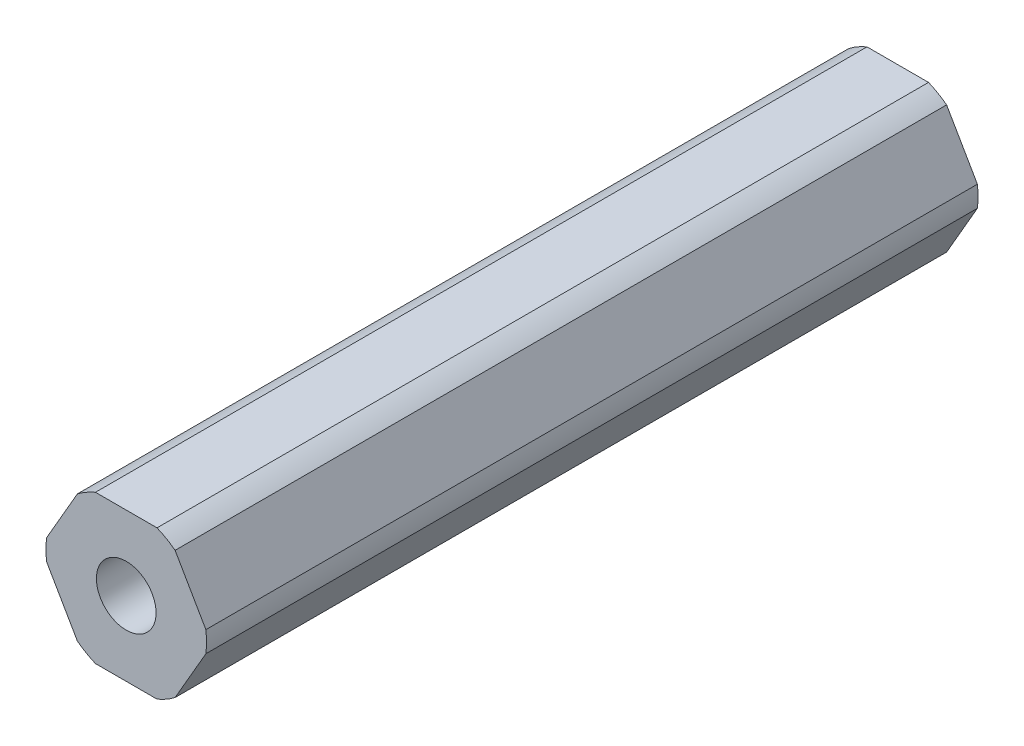
ISO-10303-21;
HEADER;
FILE_DESCRIPTION(('STEP AP214'),'2;1');
FILE_NAME('part.step','',(''),(''),'','','');
FILE_SCHEMA(('AUTOMOTIVE_DESIGN { 1 0 10303 214 1 1 1 1 }'));
ENDSEC;
DATA;
#1=APPLICATION_CONTEXT('core data for automotive mechanical design processes');
#2=APPLICATION_PROTOCOL_DEFINITION('international standard','automotive_design',2000,#1);
#3=PRODUCT_CONTEXT('',#1,'mechanical');
#4=PRODUCT('Part','Part','',(#3));
#5=PRODUCT_RELATED_PRODUCT_CATEGORY('part','',(#4));
#6=PRODUCT_DEFINITION_FORMATION('','',#4);
#7=PRODUCT_DEFINITION_CONTEXT('part definition',#1,'design');
#8=PRODUCT_DEFINITION('design','',#6,#7);
#9=PRODUCT_DEFINITION_SHAPE('','',#8);
#10=(LENGTH_UNIT() NAMED_UNIT(*) SI_UNIT(.MILLI.,.METRE.));
#11=(NAMED_UNIT(*) PLANE_ANGLE_UNIT() SI_UNIT($,.RADIAN.));
#12=(NAMED_UNIT(*) SI_UNIT($,.STERADIAN.) SOLID_ANGLE_UNIT());
#13=UNCERTAINTY_MEASURE_WITH_UNIT(LENGTH_MEASURE(1.E-05),#10,'distance_accuracy_value','');
#14=(GEOMETRIC_REPRESENTATION_CONTEXT(3) GLOBAL_UNCERTAINTY_ASSIGNED_CONTEXT((#13)) GLOBAL_UNIT_ASSIGNED_CONTEXT((#10,
#11,#12)) REPRESENTATION_CONTEXT('',''));
#15=CARTESIAN_POINT('',(0.,0.,0.));
#16=DIRECTION('',(0.,0.,1.));
#17=DIRECTION('',(1.,0.,0.));
#18=AXIS2_PLACEMENT_3D('',#15,#16,#17);
#19=CARTESIAN_POINT('',(0.,0.,66.04));
#20=DIRECTION('',(0.,0.,1.));
#21=DIRECTION('',(1.,0.,0.));
#22=AXIS2_PLACEMENT_3D('',#19,#20,#21);
#23=PLANE('',#22);
#24=CARTESIAN_POINT('',(0.,0.,66.04));
#25=DIRECTION('',(0.,0.,1.));
#26=DIRECTION('',(1.,0.,0.));
#27=AXIS2_PLACEMENT_3D('',#24,#25,#26);
#28=CIRCLE('',#27,6.875);
#29=CARTESIAN_POINT('',(-6.81675182633099,0.89303949420678,66.04));
#30=VERTEX_POINT('',#29);
#31=CARTESIAN_POINT('',(-6.81675182633099,-0.893039494206792,66.04));
#32=VERTEX_POINT('',#31);
#33=EDGE_CURVE('E179',#30,#32,#28,.T.);
#34=ORIENTED_EDGE('',*,*,#33,.T.);
#35=DIRECTION('',(0.5,-0.866025403784438,0.));
#36=VECTOR('',#35,1.);
#37=CARTESIAN_POINT('',(-6.81675182633099,-0.893039494206792,66.04));
#38=LINE('',#37,#36);
#39=CARTESIAN_POINT('',(-4.18177080173138,-5.45696050579321,66.04));
#40=VERTEX_POINT('',#39);
#41=EDGE_CURVE('E107',#32,#40,#38,.T.);
#42=ORIENTED_EDGE('',*,*,#41,.T.);
#43=CARTESIAN_POINT('',(0.,0.,66.04));
#44=DIRECTION('',(0.,0.,1.));
#45=DIRECTION('',(1.,0.,0.));
#46=AXIS2_PLACEMENT_3D('',#43,#44,#45);
#47=CIRCLE('',#46,6.875);
#48=CARTESIAN_POINT('',(-2.6349810245996,-6.35,66.04));
#49=VERTEX_POINT('',#48);
#50=EDGE_CURVE('E206',#40,#49,#47,.T.);
#51=ORIENTED_EDGE('',*,*,#50,.T.);
#52=DIRECTION('',(1.,0.,0.));
#53=VECTOR('',#52,1.);
#54=CARTESIAN_POINT('',(-2.63498102459961,-6.35,66.04));
#55=LINE('',#54,#53);
#56=CARTESIAN_POINT('',(2.63498102459961,-6.35,66.04));
#57=VERTEX_POINT('',#56);
#58=EDGE_CURVE('E225',#49,#57,#55,.T.);
#59=ORIENTED_EDGE('',*,*,#58,.T.);
#60=CARTESIAN_POINT('',(0.,0.,66.04));
#61=DIRECTION('',(0.,0.,1.));
#62=DIRECTION('',(1.,0.,0.));
#63=AXIS2_PLACEMENT_3D('',#60,#61,#62);
#64=CIRCLE('',#63,6.875);
#65=CARTESIAN_POINT('',(4.18177080173138,-5.45696050579321,66.04));
#66=VERTEX_POINT('',#65);
#67=EDGE_CURVE('E222',#57,#66,#64,.T.);
#68=ORIENTED_EDGE('',*,*,#67,.T.);
#69=DIRECTION('',(0.5,0.866025403784439,0.));
#70=VECTOR('',#69,1.);
#71=CARTESIAN_POINT('',(4.18177080173138,-5.45696050579321,66.04));
#72=LINE('',#71,#70);
#73=CARTESIAN_POINT('',(6.81675182633099,-0.893039494206781,66.04));
#74=VERTEX_POINT('',#73);
#75=EDGE_CURVE('E224',#66,#74,#72,.T.);
#76=ORIENTED_EDGE('',*,*,#75,.T.);
#77=CARTESIAN_POINT('',(0.,0.,66.04));
#78=DIRECTION('',(0.,0.,1.));
#79=DIRECTION('',(1.,0.,0.));
#80=AXIS2_PLACEMENT_3D('',#77,#78,#79);
#81=CIRCLE('',#80,6.875);
#82=CARTESIAN_POINT('',(6.81675182633099,0.893039494206792,66.04));
#83=VERTEX_POINT('',#82);
#84=EDGE_CURVE('E227',#74,#83,#81,.T.);
#85=ORIENTED_EDGE('',*,*,#84,.T.);
#86=DIRECTION('',(-0.500000000000001,0.866025403784438,0.));
#87=VECTOR('',#86,1.);
#88=CARTESIAN_POINT('',(6.81675182633099,0.893039494206793,66.04));
#89=LINE('',#88,#87);
#90=CARTESIAN_POINT('',(4.18177080173138,5.45696050579321,66.04));
#91=VERTEX_POINT('',#90);
#92=EDGE_CURVE('E233',#83,#91,#89,.T.);
#93=ORIENTED_EDGE('',*,*,#92,.T.);
#94=CARTESIAN_POINT('',(0.,0.,66.04));
#95=DIRECTION('',(0.,0.,1.));
#96=DIRECTION('',(1.,0.,0.));
#97=AXIS2_PLACEMENT_3D('',#94,#95,#96);
#98=CIRCLE('',#97,6.875);
#99=CARTESIAN_POINT('',(2.63498102459961,6.35,66.04));
#100=VERTEX_POINT('',#99);
#101=EDGE_CURVE('E138',#91,#100,#98,.T.);
#102=ORIENTED_EDGE('',*,*,#101,.T.);
#103=DIRECTION('',(-1.,0.,0.));
#104=VECTOR('',#103,1.);
#105=CARTESIAN_POINT('',(2.63498102459961,6.35,66.04));
#106=LINE('',#105,#104);
#107=CARTESIAN_POINT('',(-2.63498102459961,6.35,66.04));
#108=VERTEX_POINT('',#107);
#109=EDGE_CURVE('E132',#100,#108,#106,.T.);
#110=ORIENTED_EDGE('',*,*,#109,.T.);
#111=CARTESIAN_POINT('',(0.,0.,66.04));
#112=DIRECTION('',(0.,0.,1.));
#113=DIRECTION('',(1.,0.,0.));
#114=AXIS2_PLACEMENT_3D('',#111,#112,#113);
#115=CIRCLE('',#114,6.875);
#116=CARTESIAN_POINT('',(-4.18177080173138,5.45696050579321,66.04));
#117=VERTEX_POINT('',#116);
#118=EDGE_CURVE('E136',#108,#117,#115,.T.);
#119=ORIENTED_EDGE('',*,*,#118,.T.);
#120=DIRECTION('',(-0.499999999999999,-0.866025403784439,0.));
#121=VECTOR('',#120,1.);
#122=CARTESIAN_POINT('',(-4.18177080173138,5.45696050579321,66.04));
#123=LINE('',#122,#121);
#124=EDGE_CURVE('E52',#117,#30,#123,.T.);
#125=ORIENTED_EDGE('',*,*,#124,.T.);
#126=EDGE_LOOP('',(#34,#42,#51,#59,#68,#76,#85,#93,#102,#110,#119,#125));
#127=FACE_BOUND('',#126,.T.);
#128=CARTESIAN_POINT('',(0.,0.,66.04));
#129=DIRECTION('',(0.,0.,1.));
#130=DIRECTION('',(1.,0.,0.));
#131=AXIS2_PLACEMENT_3D('',#128,#129,#130);
#132=CIRCLE('',#131,2.5527);
#133=CARTESIAN_POINT('',(2.5527,0.,66.04));
#134=VERTEX_POINT('',#133);
#135=EDGE_CURVE('E160',#134,#134,#132,.T.);
#136=ORIENTED_EDGE('',*,*,#135,.F.);
#137=EDGE_LOOP('',(#136));
#138=FACE_BOUND('',#137,.T.);
#139=ADVANCED_FACE('F35',(#127,#138),#23,.T.);
#140=CARTESIAN_POINT('',(0.,0.,0.));
#141=DIRECTION('',(0.,0.,1.));
#142=DIRECTION('',(1.,0.,0.));
#143=AXIS2_PLACEMENT_3D('',#140,#141,#142);
#144=PLANE('',#143);
#145=CARTESIAN_POINT('',(0.,0.,0.));
#146=DIRECTION('',(0.,0.,1.));
#147=DIRECTION('',(1.,0.,0.));
#148=AXIS2_PLACEMENT_3D('',#145,#146,#147);
#149=CIRCLE('',#148,6.875);
#150=CARTESIAN_POINT('',(-6.81675182633099,0.89303949420678,0.));
#151=VERTEX_POINT('',#150);
#152=CARTESIAN_POINT('',(-6.81675182633099,-0.893039494206792,0.));
#153=VERTEX_POINT('',#152);
#154=EDGE_CURVE('E156',#151,#153,#149,.T.);
#155=ORIENTED_EDGE('',*,*,#154,.F.);
#156=DIRECTION('',(-0.499999999999999,-0.866025403784439,0.));
#157=VECTOR('',#156,1.);
#158=CARTESIAN_POINT('',(-4.18177080173138,5.45696050579321,0.));
#159=LINE('',#158,#157);
#160=CARTESIAN_POINT('',(-4.18177080173138,5.45696050579321,0.));
#161=VERTEX_POINT('',#160);
#162=EDGE_CURVE('E99',#161,#151,#159,.T.);
#163=ORIENTED_EDGE('',*,*,#162,.F.);
#164=CARTESIAN_POINT('',(0.,0.,0.));
#165=DIRECTION('',(0.,0.,1.));
#166=DIRECTION('',(1.,0.,0.));
#167=AXIS2_PLACEMENT_3D('',#164,#165,#166);
#168=CIRCLE('',#167,6.875);
#169=CARTESIAN_POINT('',(-2.63498102459961,6.35,0.));
#170=VERTEX_POINT('',#169);
#171=EDGE_CURVE('E93',#170,#161,#168,.T.);
#172=ORIENTED_EDGE('',*,*,#171,.F.);
#173=DIRECTION('',(-1.,0.,0.));
#174=VECTOR('',#173,1.);
#175=CARTESIAN_POINT('',(2.63498102459961,6.35,0.));
#176=LINE('',#175,#174);
#177=CARTESIAN_POINT('',(2.63498102459961,6.35,0.));
#178=VERTEX_POINT('',#177);
#179=EDGE_CURVE('E146',#178,#170,#176,.T.);
#180=ORIENTED_EDGE('',*,*,#179,.F.);
#181=CARTESIAN_POINT('',(0.,0.,0.));
#182=DIRECTION('',(0.,0.,1.));
#183=DIRECTION('',(1.,0.,0.));
#184=AXIS2_PLACEMENT_3D('',#181,#182,#183);
#185=CIRCLE('',#184,6.875);
#186=CARTESIAN_POINT('',(4.18177080173138,5.45696050579321,0.));
#187=VERTEX_POINT('',#186);
#188=EDGE_CURVE('E174',#187,#178,#185,.T.);
#189=ORIENTED_EDGE('',*,*,#188,.F.);
#190=DIRECTION('',(-0.500000000000001,0.866025403784438,0.));
#191=VECTOR('',#190,1.);
#192=CARTESIAN_POINT('',(6.81675182633099,0.893039494206793,0.));
#193=LINE('',#192,#191);
#194=CARTESIAN_POINT('',(6.81675182633099,0.893039494206792,0.));
#195=VERTEX_POINT('',#194);
#196=EDGE_CURVE('E172',#195,#187,#193,.T.);
#197=ORIENTED_EDGE('',*,*,#196,.F.);
#198=CARTESIAN_POINT('',(0.,0.,0.));
#199=DIRECTION('',(0.,0.,1.));
#200=DIRECTION('',(1.,0.,0.));
#201=AXIS2_PLACEMENT_3D('',#198,#199,#200);
#202=CIRCLE('',#201,6.875);
#203=CARTESIAN_POINT('',(6.81675182633099,-0.893039494206781,0.));
#204=VERTEX_POINT('',#203);
#205=EDGE_CURVE('E170',#204,#195,#202,.T.);
#206=ORIENTED_EDGE('',*,*,#205,.F.);
#207=DIRECTION('',(0.5,0.866025403784439,0.));
#208=VECTOR('',#207,1.);
#209=CARTESIAN_POINT('',(4.18177080173138,-5.45696050579321,0.));
#210=LINE('',#209,#208);
#211=CARTESIAN_POINT('',(4.18177080173138,-5.45696050579321,0.));
#212=VERTEX_POINT('',#211);
#213=EDGE_CURVE('E168',#212,#204,#210,.T.);
#214=ORIENTED_EDGE('',*,*,#213,.F.);
#215=CARTESIAN_POINT('',(0.,0.,0.));
#216=DIRECTION('',(0.,0.,1.));
#217=DIRECTION('',(1.,0.,0.));
#218=AXIS2_PLACEMENT_3D('',#215,#216,#217);
#219=CIRCLE('',#218,6.875);
#220=CARTESIAN_POINT('',(2.63498102459961,-6.35,0.));
#221=VERTEX_POINT('',#220);
#222=EDGE_CURVE('E166',#221,#212,#219,.T.);
#223=ORIENTED_EDGE('',*,*,#222,.F.);
#224=DIRECTION('',(1.,0.,0.));
#225=VECTOR('',#224,1.);
#226=CARTESIAN_POINT('',(-2.63498102459961,-6.35,0.));
#227=LINE('',#226,#225);
#228=CARTESIAN_POINT('',(-2.6349810245996,-6.35,0.));
#229=VERTEX_POINT('',#228);
#230=EDGE_CURVE('E164',#229,#221,#227,.T.);
#231=ORIENTED_EDGE('',*,*,#230,.F.);
#232=CARTESIAN_POINT('',(0.,0.,0.));
#233=DIRECTION('',(0.,0.,1.));
#234=DIRECTION('',(1.,0.,0.));
#235=AXIS2_PLACEMENT_3D('',#232,#233,#234);
#236=CIRCLE('',#235,6.875);
#237=CARTESIAN_POINT('',(-4.18177080173138,-5.45696050579321,0.));
#238=VERTEX_POINT('',#237);
#239=EDGE_CURVE('E162',#238,#229,#236,.T.);
#240=ORIENTED_EDGE('',*,*,#239,.F.);
#241=DIRECTION('',(0.5,-0.866025403784438,0.));
#242=VECTOR('',#241,1.);
#243=CARTESIAN_POINT('',(-6.81675182633099,-0.893039494206792,0.));
#244=LINE('',#243,#242);
#245=EDGE_CURVE('E159',#153,#238,#244,.T.);
#246=ORIENTED_EDGE('',*,*,#245,.F.);
#247=EDGE_LOOP('',(#155,#163,#172,#180,#189,#197,#206,#214,#223,#231,#240,#246));
#248=FACE_BOUND('',#247,.T.);
#249=CARTESIAN_POINT('',(0.,0.,0.));
#250=DIRECTION('',(0.,0.,1.));
#251=DIRECTION('',(1.,0.,0.));
#252=AXIS2_PLACEMENT_3D('',#249,#250,#251);
#253=CIRCLE('',#252,2.5527);
#254=CARTESIAN_POINT('',(2.5527,0.,0.));
#255=VERTEX_POINT('',#254);
#256=EDGE_CURVE('E380',#255,#255,#253,.T.);
#257=ORIENTED_EDGE('',*,*,#256,.T.);
#258=EDGE_LOOP('',(#257));
#259=FACE_BOUND('',#258,.T.);
#260=ADVANCED_FACE('F210',(#248,#259),#144,.F.);
#261=CARTESIAN_POINT('',(0.,0.,66.04));
#262=DIRECTION('',(0.,0.,-1.));
#263=DIRECTION('',(-1.,0.,0.));
#264=AXIS2_PLACEMENT_3D('',#261,#262,#263);
#265=CYLINDRICAL_SURFACE('',#264,6.875);
#266=ORIENTED_EDGE('',*,*,#154,.T.);
#267=DIRECTION('',(0.,0.,-1.));
#268=VECTOR('',#267,1.);
#269=CARTESIAN_POINT('',(-6.81675182633099,-0.893039494206792,66.04));
#270=LINE('',#269,#268);
#271=EDGE_CURVE('E11',#32,#153,#270,.T.);
#272=ORIENTED_EDGE('',*,*,#271,.F.);
#273=ORIENTED_EDGE('',*,*,#33,.F.);
#274=DIRECTION('',(0.,0.,-1.));
#275=VECTOR('',#274,1.);
#276=CARTESIAN_POINT('',(-6.81675182633099,0.89303949420678,66.04));
#277=LINE('',#276,#275);
#278=EDGE_CURVE('E152',#30,#151,#277,.T.);
#279=ORIENTED_EDGE('',*,*,#278,.T.);
#280=EDGE_LOOP('',(#266,#272,#273,#279));
#281=FACE_BOUND('',#280,.T.);
#282=ADVANCED_FACE('F37',(#281),#265,.T.);
#283=CARTESIAN_POINT('',(-6.81675182633099,-0.893039494206792,66.04));
#284=DIRECTION('',(0.866025403784438,0.500000000000001,0.));
#285=DIRECTION('',(-0.500000000000001,0.866025403784438,0.));
#286=AXIS2_PLACEMENT_3D('',#283,#284,#285);
#287=PLANE('',#286);
#288=ORIENTED_EDGE('',*,*,#245,.T.);
#289=DIRECTION('',(0.,0.,-1.));
#290=VECTOR('',#289,1.);
#291=CARTESIAN_POINT('',(-4.18177080173138,-5.45696050579321,66.04));
#292=LINE('',#291,#290);
#293=EDGE_CURVE('E44',#40,#238,#292,.T.);
#294=ORIENTED_EDGE('',*,*,#293,.F.);
#295=ORIENTED_EDGE('',*,*,#41,.F.);
#296=ORIENTED_EDGE('',*,*,#271,.T.);
#297=EDGE_LOOP('',(#288,#294,#295,#296));
#298=FACE_BOUND('',#297,.T.);
#299=ADVANCED_FACE('F267',(#298),#287,.F.);
#300=CARTESIAN_POINT('',(0.,0.,66.04));
#301=DIRECTION('',(0.,0.,-1.));
#302=DIRECTION('',(-1.,0.,0.));
#303=AXIS2_PLACEMENT_3D('',#300,#301,#302);
#304=CYLINDRICAL_SURFACE('',#303,6.875);
#305=ORIENTED_EDGE('',*,*,#239,.T.);
#306=DIRECTION('',(0.,0.,-1.));
#307=VECTOR('',#306,1.);
#308=CARTESIAN_POINT('',(-2.6349810245996,-6.35,66.04));
#309=LINE('',#308,#307);
#310=EDGE_CURVE('E198',#49,#229,#309,.T.);
#311=ORIENTED_EDGE('',*,*,#310,.F.);
#312=ORIENTED_EDGE('',*,*,#50,.F.);
#313=ORIENTED_EDGE('',*,*,#293,.T.);
#314=EDGE_LOOP('',(#305,#311,#312,#313));
#315=FACE_BOUND('',#314,.T.);
#316=ADVANCED_FACE('F204',(#315),#304,.T.);
#317=CARTESIAN_POINT('',(-2.63498102459961,-6.35,66.04));
#318=DIRECTION('',(0.,1.,0.));
#319=DIRECTION('',(-1.,0.,0.));
#320=AXIS2_PLACEMENT_3D('',#317,#318,#319);
#321=PLANE('',#320);
#322=ORIENTED_EDGE('',*,*,#230,.T.);
#323=DIRECTION('',(0.,0.,-1.));
#324=VECTOR('',#323,1.);
#325=CARTESIAN_POINT('',(2.63498102459961,-6.35,66.04));
#326=LINE('',#325,#324);
#327=EDGE_CURVE('E195',#57,#221,#326,.T.);
#328=ORIENTED_EDGE('',*,*,#327,.F.);
#329=ORIENTED_EDGE('',*,*,#58,.F.);
#330=ORIENTED_EDGE('',*,*,#310,.T.);
#331=EDGE_LOOP('',(#322,#328,#329,#330));
#332=FACE_BOUND('',#331,.T.);
#333=ADVANCED_FACE('F216',(#332),#321,.F.);
#334=CARTESIAN_POINT('',(0.,0.,66.04));
#335=DIRECTION('',(0.,0.,-1.));
#336=DIRECTION('',(-1.,0.,0.));
#337=AXIS2_PLACEMENT_3D('',#334,#335,#336);
#338=CYLINDRICAL_SURFACE('',#337,6.875);
#339=ORIENTED_EDGE('',*,*,#222,.T.);
#340=DIRECTION('',(0.,0.,-1.));
#341=VECTOR('',#340,1.);
#342=CARTESIAN_POINT('',(4.18177080173138,-5.45696050579321,66.04));
#343=LINE('',#342,#341);
#344=EDGE_CURVE('E192',#66,#212,#343,.T.);
#345=ORIENTED_EDGE('',*,*,#344,.F.);
#346=ORIENTED_EDGE('',*,*,#67,.F.);
#347=ORIENTED_EDGE('',*,*,#327,.T.);
#348=EDGE_LOOP('',(#339,#345,#346,#347));
#349=FACE_BOUND('',#348,.T.);
#350=ADVANCED_FACE('F220',(#349),#338,.T.);
#351=CARTESIAN_POINT('',(4.18177080173138,-5.45696050579321,66.04));
#352=DIRECTION('',(-0.866025403784439,0.5,0.));
#353=DIRECTION('',(-0.5,-0.866025403784439,0.));
#354=AXIS2_PLACEMENT_3D('',#351,#352,#353);
#355=PLANE('',#354);
#356=ORIENTED_EDGE('',*,*,#213,.T.);
#357=DIRECTION('',(0.,0.,-1.));
#358=VECTOR('',#357,1.);
#359=CARTESIAN_POINT('',(6.81675182633099,-0.893039494206781,66.04));
#360=LINE('',#359,#358);
#361=EDGE_CURVE('E189',#74,#204,#360,.T.);
#362=ORIENTED_EDGE('',*,*,#361,.F.);
#363=ORIENTED_EDGE('',*,*,#75,.F.);
#364=ORIENTED_EDGE('',*,*,#344,.T.);
#365=EDGE_LOOP('',(#356,#362,#363,#364));
#366=FACE_BOUND('',#365,.T.);
#367=ADVANCED_FACE('F280',(#366),#355,.F.);
#368=CARTESIAN_POINT('',(0.,0.,66.04));
#369=DIRECTION('',(0.,0.,-1.));
#370=DIRECTION('',(-1.,0.,0.));
#371=AXIS2_PLACEMENT_3D('',#368,#369,#370);
#372=CYLINDRICAL_SURFACE('',#371,6.875);
#373=ORIENTED_EDGE('',*,*,#205,.T.);
#374=DIRECTION('',(0.,0.,-1.));
#375=VECTOR('',#374,1.);
#376=CARTESIAN_POINT('',(6.81675182633099,0.893039494206792,66.04));
#377=LINE('',#376,#375);
#378=EDGE_CURVE('E186',#83,#195,#377,.T.);
#379=ORIENTED_EDGE('',*,*,#378,.F.);
#380=ORIENTED_EDGE('',*,*,#84,.F.);
#381=ORIENTED_EDGE('',*,*,#361,.T.);
#382=EDGE_LOOP('',(#373,#379,#380,#381));
#383=FACE_BOUND('',#382,.T.);
#384=ADVANCED_FACE('F283',(#383),#372,.T.);
#385=CARTESIAN_POINT('',(6.81675182633099,0.893039494206793,66.04));
#386=DIRECTION('',(-0.866025403784438,-0.500000000000001,0.));
#387=DIRECTION('',(0.500000000000001,-0.866025403784438,0.));
#388=AXIS2_PLACEMENT_3D('',#385,#386,#387);
#389=PLANE('',#388);
#390=ORIENTED_EDGE('',*,*,#196,.T.);
#391=DIRECTION('',(0.,0.,-1.));
#392=VECTOR('',#391,1.);
#393=CARTESIAN_POINT('',(4.18177080173138,5.45696050579321,66.04));
#394=LINE('',#393,#392);
#395=EDGE_CURVE('E183',#91,#187,#394,.T.);
#396=ORIENTED_EDGE('',*,*,#395,.F.);
#397=ORIENTED_EDGE('',*,*,#92,.F.);
#398=ORIENTED_EDGE('',*,*,#378,.T.);
#399=EDGE_LOOP('',(#390,#396,#397,#398));
#400=FACE_BOUND('',#399,.T.);
#401=ADVANCED_FACE('F239',(#400),#389,.F.);
#402=CARTESIAN_POINT('',(0.,0.,66.04));
#403=DIRECTION('',(0.,0.,-1.));
#404=DIRECTION('',(-1.,0.,0.));
#405=AXIS2_PLACEMENT_3D('',#402,#403,#404);
#406=CYLINDRICAL_SURFACE('',#405,6.875);
#407=ORIENTED_EDGE('',*,*,#188,.T.);
#408=DIRECTION('',(0.,0.,-1.));
#409=VECTOR('',#408,1.);
#410=CARTESIAN_POINT('',(2.63498102459961,6.35,66.04));
#411=LINE('',#410,#409);
#412=EDGE_CURVE('E147',#100,#178,#411,.T.);
#413=ORIENTED_EDGE('',*,*,#412,.F.);
#414=ORIENTED_EDGE('',*,*,#101,.F.);
#415=ORIENTED_EDGE('',*,*,#395,.T.);
#416=EDGE_LOOP('',(#407,#413,#414,#415));
#417=FACE_BOUND('',#416,.T.);
#418=ADVANCED_FACE('F243',(#417),#406,.T.);
#419=CARTESIAN_POINT('',(2.63498102459961,6.35,66.04));
#420=DIRECTION('',(0.,-1.,0.));
#421=DIRECTION('',(0.,0.,-1.));
#422=AXIS2_PLACEMENT_3D('',#419,#420,#421);
#423=PLANE('',#422);
#424=ORIENTED_EDGE('',*,*,#179,.T.);
#425=DIRECTION('',(0.,0.,-1.));
#426=VECTOR('',#425,1.);
#427=CARTESIAN_POINT('',(-2.63498102459961,6.35,66.04));
#428=LINE('',#427,#426);
#429=EDGE_CURVE('E143',#108,#170,#428,.T.);
#430=ORIENTED_EDGE('',*,*,#429,.F.);
#431=ORIENTED_EDGE('',*,*,#109,.F.);
#432=ORIENTED_EDGE('',*,*,#412,.T.);
#433=EDGE_LOOP('',(#424,#430,#431,#432));
#434=FACE_BOUND('',#433,.T.);
#435=ADVANCED_FACE('F144',(#434),#423,.F.);
#436=CARTESIAN_POINT('',(0.,0.,66.04));
#437=DIRECTION('',(0.,0.,-1.));
#438=DIRECTION('',(-1.,0.,0.));
#439=AXIS2_PLACEMENT_3D('',#436,#437,#438);
#440=CYLINDRICAL_SURFACE('',#439,6.875);
#441=ORIENTED_EDGE('',*,*,#171,.T.);
#442=DIRECTION('',(0.,0.,-1.));
#443=VECTOR('',#442,1.);
#444=CARTESIAN_POINT('',(-4.18177080173138,5.45696050579321,66.04));
#445=LINE('',#444,#443);
#446=EDGE_CURVE('E148',#117,#161,#445,.T.);
#447=ORIENTED_EDGE('',*,*,#446,.F.);
#448=ORIENTED_EDGE('',*,*,#118,.F.);
#449=ORIENTED_EDGE('',*,*,#429,.T.);
#450=EDGE_LOOP('',(#441,#447,#448,#449));
#451=FACE_BOUND('',#450,.T.);
#452=ADVANCED_FACE('F150',(#451),#440,.T.);
#453=CARTESIAN_POINT('',(-4.18177080173138,5.45696050579321,66.04));
#454=DIRECTION('',(0.866025403784439,-0.499999999999999,0.));
#455=DIRECTION('',(0.499999999999999,0.866025403784439,0.));
#456=AXIS2_PLACEMENT_3D('',#453,#454,#455);
#457=PLANE('',#456);
#458=ORIENTED_EDGE('',*,*,#162,.T.);
#459=ORIENTED_EDGE('',*,*,#278,.F.);
#460=ORIENTED_EDGE('',*,*,#124,.F.);
#461=ORIENTED_EDGE('',*,*,#446,.T.);
#462=EDGE_LOOP('',(#458,#459,#460,#461));
#463=FACE_BOUND('',#462,.T.);
#464=ADVANCED_FACE('F247',(#463),#457,.F.);
#465=CARTESIAN_POINT('',(0.,0.,66.04));
#466=DIRECTION('',(0.,0.,-1.));
#467=DIRECTION('',(-1.,0.,0.));
#468=AXIS2_PLACEMENT_3D('',#465,#466,#467);
#469=CYLINDRICAL_SURFACE('',#468,2.5527);
#470=ORIENTED_EDGE('',*,*,#135,.T.);
#471=EDGE_LOOP('',(#470));
#472=FACE_BOUND('',#471,.T.);
#473=ORIENTED_EDGE('',*,*,#256,.F.);
#474=EDGE_LOOP('',(#473));
#475=FACE_BOUND('',#474,.T.);
#476=ADVANCED_FACE('F249',(#472,#475),#469,.F.);
#477=CLOSED_SHELL('',(#139,#260,#282,#299,#316,#333,#350,#367,#384,#401,#418,#435,#452,#464,#476));
#478=MANIFOLD_SOLID_BREP('B2',#477);
#479=ADVANCED_BREP_SHAPE_REPRESENTATION('',(#18,#478),#14);
#480=SHAPE_DEFINITION_REPRESENTATION(#9,#479);
ENDSEC;
END-ISO-10303-21;
